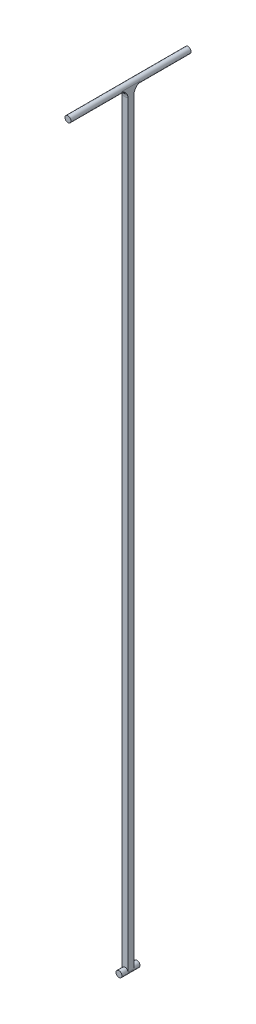
ISO-10303-21;
HEADER;
FILE_DESCRIPTION(('STEP AP214'),'2;1');
FILE_NAME('part.step','',(''),(''),'','','');
FILE_SCHEMA(('AUTOMOTIVE_DESIGN { 1 0 10303 214 1 1 1 1 }'));
ENDSEC;
DATA;
#1=APPLICATION_CONTEXT('core data for automotive mechanical design processes');
#2=APPLICATION_PROTOCOL_DEFINITION('international standard','automotive_design',2000,#1);
#3=PRODUCT_CONTEXT('',#1,'mechanical');
#4=PRODUCT('Part','Part','',(#3));
#5=PRODUCT_RELATED_PRODUCT_CATEGORY('part','',(#4));
#6=PRODUCT_DEFINITION_FORMATION('','',#4);
#7=PRODUCT_DEFINITION_CONTEXT('part definition',#1,'design');
#8=PRODUCT_DEFINITION('design','',#6,#7);
#9=PRODUCT_DEFINITION_SHAPE('','',#8);
#10=(LENGTH_UNIT() NAMED_UNIT(*) SI_UNIT(.MILLI.,.METRE.));
#11=(NAMED_UNIT(*) PLANE_ANGLE_UNIT() SI_UNIT($,.RADIAN.));
#12=(NAMED_UNIT(*) SI_UNIT($,.STERADIAN.) SOLID_ANGLE_UNIT());
#13=UNCERTAINTY_MEASURE_WITH_UNIT(LENGTH_MEASURE(1.E-05),#10,'distance_accuracy_value','');
#14=(GEOMETRIC_REPRESENTATION_CONTEXT(3) GLOBAL_UNCERTAINTY_ASSIGNED_CONTEXT((#13)) GLOBAL_UNIT_ASSIGNED_CONTEXT((#10,
#11,#12)) REPRESENTATION_CONTEXT('',''));
#15=CARTESIAN_POINT('',(0.,0.,0.));
#16=DIRECTION('',(0.,0.,1.));
#17=DIRECTION('',(1.,0.,0.));
#18=AXIS2_PLACEMENT_3D('',#15,#16,#17);
#19=CARTESIAN_POINT('',(2.54,647.7,50.8));
#20=DIRECTION('',(0.,0.,-1.));
#21=DIRECTION('',(-1.,0.,0.));
#22=AXIS2_PLACEMENT_3D('',#19,#20,#21);
#23=CYLINDRICAL_SURFACE('',#22,2.53999999999996);
#24=DIRECTION('',(0.,0.,-1.));
#25=VECTOR('',#24,1.);
#26=CARTESIAN_POINT('',(5.08,647.7,2.54));
#27=LINE('',#26,#25);
#28=CARTESIAN_POINT('',(5.07999999999996,647.7,7.62));
#29=VERTEX_POINT('',#28);
#30=CARTESIAN_POINT('',(5.07999999999996,647.7,-7.62));
#31=VERTEX_POINT('',#30);
#32=EDGE_CURVE('E57',#29,#31,#27,.T.);
#33=ORIENTED_EDGE('',*,*,#32,.T.);
#34=CARTESIAN_POINT('',(2.54,647.7,-7.62));
#35=DIRECTION('',(0.,0.,1.));
#36=DIRECTION('',(1.,0.,0.));
#37=AXIS2_PLACEMENT_3D('',#34,#35,#36);
#38=CIRCLE('',#37,2.53999999999996);
#39=CARTESIAN_POINT('',(0.,647.7,-7.62));
#40=VERTEX_POINT('',#39);
#41=EDGE_CURVE('E168',#31,#40,#38,.F.);
#42=ORIENTED_EDGE('',*,*,#41,.T.);
#43=DIRECTION('',(0.,0.,-1.));
#44=VECTOR('',#43,1.);
#45=CARTESIAN_POINT('',(0.,647.7,2.54));
#46=LINE('',#45,#44);
#47=CARTESIAN_POINT('',(0.,647.7,7.62));
#48=VERTEX_POINT('',#47);
#49=EDGE_CURVE('E64',#48,#40,#46,.T.);
#50=ORIENTED_EDGE('',*,*,#49,.F.);
#51=CARTESIAN_POINT('',(2.54,647.7,7.62));
#52=DIRECTION('',(0.,0.,1.));
#53=DIRECTION('',(1.,0.,0.));
#54=AXIS2_PLACEMENT_3D('',#51,#52,#53);
#55=CIRCLE('',#54,2.53999999999996);
#56=EDGE_CURVE('E135',#48,#29,#55,.T.);
#57=ORIENTED_EDGE('',*,*,#56,.T.);
#58=EDGE_LOOP('',(#33,#42,#50,#57));
#59=FACE_BOUND('',#58,.T.);
#60=CARTESIAN_POINT('',(2.54,647.7,50.8));
#61=DIRECTION('',(0.,0.,1.));
#62=DIRECTION('',(1.,0.,0.));
#63=AXIS2_PLACEMENT_3D('',#60,#61,#62);
#64=CIRCLE('',#63,2.53999999999996);
#65=CARTESIAN_POINT('',(5.07999999999996,647.7,50.8));
#66=VERTEX_POINT('',#65);
#67=EDGE_CURVE('E132',#66,#66,#64,.T.);
#68=ORIENTED_EDGE('',*,*,#67,.F.);
#69=EDGE_LOOP('',(#68));
#70=FACE_BOUND('',#69,.T.);
#71=CARTESIAN_POINT('',(2.54,647.7,-50.8));
#72=DIRECTION('',(0.,0.,1.));
#73=DIRECTION('',(1.,0.,0.));
#74=AXIS2_PLACEMENT_3D('',#71,#72,#73);
#75=CIRCLE('',#74,2.53999999999996);
#76=CARTESIAN_POINT('',(5.07999999999996,647.7,-50.8));
#77=VERTEX_POINT('',#76);
#78=EDGE_CURVE('E131',#77,#77,#75,.T.);
#79=ORIENTED_EDGE('',*,*,#78,.T.);
#80=EDGE_LOOP('',(#79));
#81=FACE_BOUND('',#80,.T.);
#82=ADVANCED_FACE('F37',(#59,#70,#81),#23,.T.);
#83=CARTESIAN_POINT('',(0.,0.,50.8));
#84=DIRECTION('',(0.,0.,1.));
#85=DIRECTION('',(1.,0.,0.));
#86=AXIS2_PLACEMENT_3D('',#83,#84,#85);
#87=PLANE('',#86);
#88=ORIENTED_EDGE('',*,*,#67,.T.);
#89=EDGE_LOOP('',(#88));
#90=FACE_BOUND('',#89,.T.);
#91=ADVANCED_FACE('F199',(#90),#87,.T.);
#92=CARTESIAN_POINT('',(0.,0.,-50.8));
#93=DIRECTION('',(0.,0.,1.));
#94=DIRECTION('',(1.,0.,0.));
#95=AXIS2_PLACEMENT_3D('',#92,#93,#94);
#96=PLANE('',#95);
#97=ORIENTED_EDGE('',*,*,#78,.F.);
#98=EDGE_LOOP('',(#97));
#99=FACE_BOUND('',#98,.T.);
#100=ADVANCED_FACE('F203',(#99),#96,.F.);
#101=CARTESIAN_POINT('',(0.,0.,2.54));
#102=DIRECTION('',(-1.,0.,0.));
#103=DIRECTION('',(0.,0.,1.));
#104=AXIS2_PLACEMENT_3D('',#101,#102,#103);
#105=PLANE('',#104);
#106=DIRECTION('',(0.,1.,0.));
#107=VECTOR('',#106,1.);
#108=CARTESIAN_POINT('',(0.,0.,-2.54));
#109=LINE('',#108,#107);
#110=CARTESIAN_POINT('',(0.,0.,-2.54));
#111=VERTEX_POINT('',#110);
#112=CARTESIAN_POINT('',(0.,640.515795103145,-2.54));
#113=VERTEX_POINT('',#112);
#114=EDGE_CURVE('E114',#111,#113,#109,.T.);
#115=ORIENTED_EDGE('',*,*,#114,.F.);
#116=DIRECTION('',(0.,0.,-1.));
#117=VECTOR('',#116,1.);
#118=CARTESIAN_POINT('',(0.,0.,2.54));
#119=LINE('',#118,#117);
#120=CARTESIAN_POINT('',(0.,0.,2.54));
#121=VERTEX_POINT('',#120);
#122=EDGE_CURVE('E97',#121,#111,#119,.T.);
#123=ORIENTED_EDGE('',*,*,#122,.F.);
#124=DIRECTION('',(0.,1.,0.));
#125=VECTOR('',#124,1.);
#126=CARTESIAN_POINT('',(0.,0.,2.54));
#127=LINE('',#126,#125);
#128=CARTESIAN_POINT('',(0.,640.515795103145,2.54));
#129=VERTEX_POINT('',#128);
#130=EDGE_CURVE('E111',#121,#129,#127,.T.);
#131=ORIENTED_EDGE('',*,*,#130,.T.);
#132=CARTESIAN_POINT('',(0.,640.515795103145,2.54));
#133=CARTESIAN_POINT('',(0.,640.677913402386,2.53997782210612));
#134=CARTESIAN_POINT('',(0.,640.839997087751,2.54689636916217));
#135=CARTESIAN_POINT('',(0.,641.16293905413,2.57413085099029));
#136=CARTESIAN_POINT('',(0.,641.323798032665,2.59443847574302));
#137=CARTESIAN_POINT('',(0.,641.642506162993,2.64782884435624));
#138=CARTESIAN_POINT('',(0.,641.800366625536,2.68084451828428));
#139=CARTESIAN_POINT('',(0.,642.113055814435,2.75905466480061));
#140=CARTESIAN_POINT('',(0.,642.267884058385,2.80425105864665));
#141=CARTESIAN_POINT('',(0.,642.58070383563,2.90846484135424));
#142=CARTESIAN_POINT('',(0.,642.738515879739,2.96802006900518));
#143=CARTESIAN_POINT('',(0.,643.049260725011,3.09883873769944));
#144=CARTESIAN_POINT('',(0.,643.202191672727,3.1701065645357));
#145=CARTESIAN_POINT('',(0.,643.502659133408,3.32344529845667));
#146=CARTESIAN_POINT('',(0.,643.650191808305,3.40552370801576));
#147=CARTESIAN_POINT('',(0.,643.939390760913,3.57946083076629));
#148=CARTESIAN_POINT('',(0.,644.081055581168,3.67132195379304));
#149=CARTESIAN_POINT('',(0.,644.447537866731,3.92578667631235));
#150=CARTESIAN_POINT('',(0.,644.667192036797,4.09586942697861));
#151=CARTESIAN_POINT('',(0.,645.090172695402,4.45525787478396));
#152=CARTESIAN_POINT('',(0.,645.293488871277,4.64457554508643));
#153=CARTESIAN_POINT('',(0.,645.685414197702,5.03837337326046));
#154=CARTESIAN_POINT('',(0.,645.873997891857,5.2428786346769));
#155=CARTESIAN_POINT('',(0.,646.238583028158,5.66281129752192));
#156=CARTESIAN_POINT('',(0.,646.41458026407,5.87824230946691));
#157=CARTESIAN_POINT('',(0.,646.682088329059,6.22022690890976));
#158=CARTESIAN_POINT('',(0.,646.776796427662,6.34431697695068));
#159=CARTESIAN_POINT('',(0.,646.963848556343,6.59403050275234));
#160=CARTESIAN_POINT('',(0.,647.056195326432,6.71965190782634));
#161=CARTESIAN_POINT('',(-1.57461347612243E-13,647.331178473491,7.09851652832316));
#162=CARTESIAN_POINT('',(-8.59491968866862E-13,647.511502858147,7.35342641884824));
#163=CARTESIAN_POINT('',(0.,647.694513318302,7.61224065871788));
#164=CARTESIAN_POINT('',(0.,647.697256660457,7.61612033036977));
#165=CARTESIAN_POINT('',(0.,647.7,7.62));
#166=B_SPLINE_CURVE_WITH_KNOTS('',3,(#132,#133,#134,#135,#136,#137,#138,#139,#140,#141,#142,
#143,#144,#145,#146,#147,#148,#149,#150,#151,#152,#153,#154,#155,#156,#157,#158,#159,#160,#161,
#162,#163,#164,#165),.UNSPECIFIED.,.F.,.F.,(4,2,2,2,2,2,2,2,2,2,2,2,2,2,2,2,4),(0.,
0.486156207553584,0.972010962739089,1.45533589878787,1.93873711405417,2.4442602810462,
2.94997317473188,3.45603889756689,3.96222957227925,4.79420354342264,5.62669860381471,
6.46060170736098,7.2947822007556,7.76306860814067,8.23078440609117,9.16747521363274,
9.18173003737773),.UNSPECIFIED.);
#167=EDGE_CURVE('E146',#129,#48,#166,.T.);
#168=ORIENTED_EDGE('',*,*,#167,.T.);
#169=ORIENTED_EDGE('',*,*,#49,.T.);
#170=CARTESIAN_POINT('',(0.,640.515795103145,-2.54));
#171=CARTESIAN_POINT('',(0.,640.677913402386,-2.53997782210612));
#172=CARTESIAN_POINT('',(0.,640.839997087751,-2.54689636916217));
#173=CARTESIAN_POINT('',(0.,641.16293905413,-2.57413085099029));
#174=CARTESIAN_POINT('',(0.,641.323798032665,-2.59443847574302));
#175=CARTESIAN_POINT('',(0.,641.642506162993,-2.64782884435624));
#176=CARTESIAN_POINT('',(0.,641.800366625536,-2.68084451828428));
#177=CARTESIAN_POINT('',(0.,642.113055814435,-2.75905466480061));
#178=CARTESIAN_POINT('',(0.,642.267884058385,-2.80425105864665));
#179=CARTESIAN_POINT('',(0.,642.58070383563,-2.90846484135424));
#180=CARTESIAN_POINT('',(0.,642.738515879739,-2.96802006900518));
#181=CARTESIAN_POINT('',(0.,643.049260725011,-3.09883873769944));
#182=CARTESIAN_POINT('',(0.,643.202191672727,-3.1701065645357));
#183=CARTESIAN_POINT('',(0.,643.502659133408,-3.32344529845667));
#184=CARTESIAN_POINT('',(0.,643.650191808305,-3.40552370801576));
#185=CARTESIAN_POINT('',(0.,643.939390760913,-3.57946083076629));
#186=CARTESIAN_POINT('',(0.,644.081055581168,-3.67132195379304));
#187=CARTESIAN_POINT('',(0.,644.447537866731,-3.92578667631235));
#188=CARTESIAN_POINT('',(0.,644.667192036797,-4.09586942697861));
#189=CARTESIAN_POINT('',(0.,645.090172695402,-4.45525787478396));
#190=CARTESIAN_POINT('',(0.,645.293488871277,-4.64457554508643));
#191=CARTESIAN_POINT('',(0.,645.685414197702,-5.03837337326046));
#192=CARTESIAN_POINT('',(0.,645.873997891857,-5.2428786346769));
#193=CARTESIAN_POINT('',(0.,646.238583028158,-5.66281129752192));
#194=CARTESIAN_POINT('',(0.,646.41458026407,-5.87824230946691));
#195=CARTESIAN_POINT('',(0.,646.682088329059,-6.22022690890976));
#196=CARTESIAN_POINT('',(0.,646.776796427662,-6.34431697695068));
#197=CARTESIAN_POINT('',(0.,646.963848556343,-6.59403050275234));
#198=CARTESIAN_POINT('',(0.,647.056195326432,-6.71965190782634));
#199=CARTESIAN_POINT('',(-1.57461347612243E-13,647.331178473491,-7.09851652832316));
#200=CARTESIAN_POINT('',(-8.59491968866862E-13,647.511502858147,-7.35342641884824));
#201=CARTESIAN_POINT('',(0.,647.694513318302,-7.61224065871788));
#202=CARTESIAN_POINT('',(0.,647.697256660457,-7.61612033036977));
#203=CARTESIAN_POINT('',(0.,647.7,-7.62));
#204=B_SPLINE_CURVE_WITH_KNOTS('',3,(#170,#171,#172,#173,#174,#175,#176,#177,#178,#179,#180,
#181,#182,#183,#184,#185,#186,#187,#188,#189,#190,#191,#192,#193,#194,#195,#196,#197,#198,#199,
#200,#201,#202,#203),.UNSPECIFIED.,.F.,.F.,(4,2,2,2,2,2,2,2,2,2,2,2,2,2,2,2,4),(0.,
0.486156207553584,0.972010962739089,1.45533589878787,1.93873711405417,2.4442602810462,
2.94997317473188,3.45603889756689,3.96222957227925,4.79420354342264,5.62669860381471,
6.46060170736098,7.2947822007556,7.76306860814067,8.23078440609117,9.16747521363274,
9.18173003737773),.UNSPECIFIED.);
#205=EDGE_CURVE('E11',#40,#113,#204,.F.);
#206=ORIENTED_EDGE('',*,*,#205,.T.);
#207=EDGE_LOOP('',(#115,#123,#131,#168,#169,#206));
#208=FACE_BOUND('',#207,.T.);
#209=ADVANCED_FACE('F110',(#208),#105,.T.);
#210=CARTESIAN_POINT('',(5.08,0.,2.54));
#211=DIRECTION('',(-1.,0.,0.));
#212=DIRECTION('',(0.,0.,1.));
#213=AXIS2_PLACEMENT_3D('',#210,#211,#212);
#214=PLANE('',#213);
#215=DIRECTION('',(0.,1.,0.));
#216=VECTOR('',#215,1.);
#217=CARTESIAN_POINT('',(5.08,0.,-2.54));
#218=LINE('',#217,#216);
#219=CARTESIAN_POINT('',(5.08,0.,-2.54));
#220=VERTEX_POINT('',#219);
#221=CARTESIAN_POINT('',(5.08,640.515795103145,-2.54));
#222=VERTEX_POINT('',#221);
#223=EDGE_CURVE('E120',#220,#222,#218,.T.);
#224=ORIENTED_EDGE('',*,*,#223,.T.);
#225=CARTESIAN_POINT('',(5.08000000000002,640.515795103145,-2.54));
#226=CARTESIAN_POINT('',(5.08000000000001,640.677913402386,-2.53997782210612));
#227=CARTESIAN_POINT('',(5.08,640.839997087751,-2.54689636916217));
#228=CARTESIAN_POINT('',(5.08,641.162939054129,-2.57413085099025));
#229=CARTESIAN_POINT('',(5.08,641.323798032664,-2.59443847574296));
#230=CARTESIAN_POINT('',(5.08,641.642506162992,-2.64782884435615));
#231=CARTESIAN_POINT('',(5.08,641.800366625535,-2.6808445182842));
#232=CARTESIAN_POINT('',(5.08,642.113055814435,-2.75905466480057));
#233=CARTESIAN_POINT('',(5.08,642.267884058385,-2.80425105864662));
#234=CARTESIAN_POINT('',(5.08,642.58070383563,-2.90846484135427));
#235=CARTESIAN_POINT('',(5.08,642.738515879739,-2.96802006900523));
#236=CARTESIAN_POINT('',(5.08,643.049260725011,-3.09883873769955));
#237=CARTESIAN_POINT('',(5.08,643.202191672727,-3.17010656453584));
#238=CARTESIAN_POINT('',(5.08,643.502659133408,-3.32344529845682));
#239=CARTESIAN_POINT('',(5.08,643.650191808305,-3.40552370801588));
#240=CARTESIAN_POINT('',(5.08,643.939390760914,-3.57946083076635));
#241=CARTESIAN_POINT('',(5.08,644.081055581168,-3.67132195379306));
#242=CARTESIAN_POINT('',(5.08,644.447537866731,-3.92578667631223));
#243=CARTESIAN_POINT('',(5.08,644.667192036797,-4.09586942697837));
#244=CARTESIAN_POINT('',(5.08,645.090172695402,-4.45525787478343));
#245=CARTESIAN_POINT('',(5.08,645.293488871276,-4.64457554508572));
#246=CARTESIAN_POINT('',(5.08,645.685414197701,-5.03837337325971));
#247=CARTESIAN_POINT('',(5.08,645.873997891857,-5.24287863467633));
#248=CARTESIAN_POINT('',(5.08,646.238583028157,-5.66281129752146));
#249=CARTESIAN_POINT('',(5.07999999999999,646.41458026407,-5.8782423094664));
#250=CARTESIAN_POINT('',(5.08000000000001,646.682088329058,-6.22022690890989));
#251=CARTESIAN_POINT('',(5.08000000000002,646.776796427662,-6.34431697695116));
#252=CARTESIAN_POINT('',(5.07999999999998,646.963848556344,-6.59403050275183));
#253=CARTESIAN_POINT('',(5.07999999999993,647.056195326435,-6.71965190782449));
#254=CARTESIAN_POINT('',(5.08000000000014,647.331178473485,-7.09851652832672));
#255=CARTESIAN_POINT('',(5.08000000000076,647.511502858119,-7.35342641886791));
#256=CARTESIAN_POINT('',(5.07999999999999,647.694513318301,-7.6122406587185));
#257=CARTESIAN_POINT('',(5.07999999999998,647.697256660457,-7.61612033037009));
#258=CARTESIAN_POINT('',(5.07999999999996,647.7,-7.62));
#259=B_SPLINE_CURVE_WITH_KNOTS('',3,(#225,#226,#227,#228,#229,#230,#231,#232,#233,#234,#235,
#236,#237,#238,#239,#240,#241,#242,#243,#244,#245,#246,#247,#248,#249,#250,#251,#252,#253,#254,
#255,#256,#257,#258),.UNSPECIFIED.,.F.,.F.,(4,2,2,2,2,2,2,2,2,2,2,2,2,2,2,2,4),(0.,
0.486156207553361,0.972010962738526,1.45533589878764,1.93873711405417,2.44426028104644,
2.94997317473226,3.45603889756702,3.96222957227925,4.79420354342195,5.62669860381347,
6.46060170736029,7.29478220075546,7.76306860814068,8.23078440609101,9.16747521363277,
9.18173003737772),.UNSPECIFIED.);
#260=EDGE_CURVE('E50',#222,#31,#259,.T.);
#261=ORIENTED_EDGE('',*,*,#260,.T.);
#262=ORIENTED_EDGE('',*,*,#32,.F.);
#263=CARTESIAN_POINT('',(5.08000000000002,640.515795103145,2.54));
#264=CARTESIAN_POINT('',(5.08000000000001,640.677913402386,2.53997782210612));
#265=CARTESIAN_POINT('',(5.08,640.839997087751,2.54689636916217));
#266=CARTESIAN_POINT('',(5.08,641.162939054129,2.57413085099025));
#267=CARTESIAN_POINT('',(5.08,641.323798032664,2.59443847574296));
#268=CARTESIAN_POINT('',(5.08,641.642506162992,2.64782884435615));
#269=CARTESIAN_POINT('',(5.08,641.800366625535,2.6808445182842));
#270=CARTESIAN_POINT('',(5.08,642.113055814435,2.75905466480057));
#271=CARTESIAN_POINT('',(5.08,642.267884058385,2.80425105864662));
#272=CARTESIAN_POINT('',(5.08,642.58070383563,2.90846484135427));
#273=CARTESIAN_POINT('',(5.08,642.738515879739,2.96802006900523));
#274=CARTESIAN_POINT('',(5.08,643.049260725011,3.09883873769955));
#275=CARTESIAN_POINT('',(5.08,643.202191672727,3.17010656453584));
#276=CARTESIAN_POINT('',(5.08,643.502659133408,3.32344529845682));
#277=CARTESIAN_POINT('',(5.08,643.650191808305,3.40552370801588));
#278=CARTESIAN_POINT('',(5.08,643.939390760914,3.57946083076635));
#279=CARTESIAN_POINT('',(5.08,644.081055581168,3.67132195379306));
#280=CARTESIAN_POINT('',(5.08,644.447537866731,3.92578667631223));
#281=CARTESIAN_POINT('',(5.08,644.667192036797,4.09586942697837));
#282=CARTESIAN_POINT('',(5.08,645.090172695402,4.45525787478343));
#283=CARTESIAN_POINT('',(5.08,645.293488871276,4.64457554508572));
#284=CARTESIAN_POINT('',(5.08,645.685414197701,5.03837337325971));
#285=CARTESIAN_POINT('',(5.08,645.873997891857,5.24287863467633));
#286=CARTESIAN_POINT('',(5.08,646.238583028157,5.66281129752146));
#287=CARTESIAN_POINT('',(5.07999999999999,646.41458026407,5.8782423094664));
#288=CARTESIAN_POINT('',(5.08000000000001,646.682088329058,6.22022690890989));
#289=CARTESIAN_POINT('',(5.08000000000002,646.776796427662,6.34431697695116));
#290=CARTESIAN_POINT('',(5.07999999999998,646.963848556344,6.59403050275183));
#291=CARTESIAN_POINT('',(5.07999999999993,647.056195326435,6.71965190782449));
#292=CARTESIAN_POINT('',(5.08000000000014,647.331178473485,7.09851652832672));
#293=CARTESIAN_POINT('',(5.08000000000076,647.511502858119,7.35342641886791));
#294=CARTESIAN_POINT('',(5.07999999999999,647.694513318301,7.6122406587185));
#295=CARTESIAN_POINT('',(5.07999999999998,647.697256660457,7.61612033037009));
#296=CARTESIAN_POINT('',(5.07999999999996,647.7,7.62));
#297=B_SPLINE_CURVE_WITH_KNOTS('',3,(#263,#264,#265,#266,#267,#268,#269,#270,#271,#272,#273,
#274,#275,#276,#277,#278,#279,#280,#281,#282,#283,#284,#285,#286,#287,#288,#289,#290,#291,#292,
#293,#294,#295,#296),.UNSPECIFIED.,.F.,.F.,(4,2,2,2,2,2,2,2,2,2,2,2,2,2,2,2,4),(0.,
0.486156207553361,0.972010962738526,1.45533589878764,1.93873711405417,2.44426028104644,
2.94997317473226,3.45603889756702,3.96222957227925,4.79420354342195,5.62669860381347,
6.46060170736029,7.29478220075546,7.76306860814068,8.23078440609101,9.16747521363277,
9.18173003737772),.UNSPECIFIED.);
#298=CARTESIAN_POINT('',(5.08,640.515795103145,2.54));
#299=VERTEX_POINT('',#298);
#300=EDGE_CURVE('E140',#29,#299,#297,.F.);
#301=ORIENTED_EDGE('',*,*,#300,.T.);
#302=DIRECTION('',(0.,1.,0.));
#303=VECTOR('',#302,1.);
#304=CARTESIAN_POINT('',(5.08,0.,2.54));
#305=LINE('',#304,#303);
#306=CARTESIAN_POINT('',(5.08,0.,2.54));
#307=VERTEX_POINT('',#306);
#308=EDGE_CURVE('E119',#307,#299,#305,.T.);
#309=ORIENTED_EDGE('',*,*,#308,.F.);
#310=DIRECTION('',(0.,0.,-1.));
#311=VECTOR('',#310,1.);
#312=CARTESIAN_POINT('',(5.08,0.,2.54));
#313=LINE('',#312,#311);
#314=EDGE_CURVE('E100',#307,#220,#313,.T.);
#315=ORIENTED_EDGE('',*,*,#314,.T.);
#316=EDGE_LOOP('',(#224,#261,#262,#301,#309,#315));
#317=FACE_BOUND('',#316,.T.);
#318=ADVANCED_FACE('F154',(#317),#214,.F.);
#319=CARTESIAN_POINT('',(0.,0.,2.54));
#320=DIRECTION('',(0.,0.,1.));
#321=DIRECTION('',(1.,0.,0.));
#322=AXIS2_PLACEMENT_3D('',#319,#320,#321);
#323=PLANE('',#322);
#324=ORIENTED_EDGE('',*,*,#308,.T.);
#325=CARTESIAN_POINT('',(2.54,647.7,2.54));
#326=DIRECTION('',(0.,0.,1.));
#327=DIRECTION('',(1.,0.,0.));
#328=AXIS2_PLACEMENT_3D('',#325,#326,#327);
#329=CIRCLE('',#328,7.61999999999996);
#330=EDGE_CURVE('E118',#299,#129,#329,.F.);
#331=ORIENTED_EDGE('',*,*,#330,.T.);
#332=ORIENTED_EDGE('',*,*,#130,.F.);
#333=CARTESIAN_POINT('',(2.54,0.,2.54));
#334=DIRECTION('',(0.,0.,1.));
#335=DIRECTION('',(1.,0.,0.));
#336=AXIS2_PLACEMENT_3D('',#333,#334,#335);
#337=CIRCLE('',#336,2.54);
#338=EDGE_CURVE('E93',#307,#121,#337,.T.);
#339=ORIENTED_EDGE('',*,*,#338,.F.);
#340=EDGE_LOOP('',(#324,#331,#332,#339));
#341=FACE_BOUND('',#340,.T.);
#342=ADVANCED_FACE('F116',(#341),#323,.T.);
#343=CARTESIAN_POINT('',(0.,0.,-2.54));
#344=DIRECTION('',(0.,0.,1.));
#345=DIRECTION('',(1.,0.,0.));
#346=AXIS2_PLACEMENT_3D('',#343,#344,#345);
#347=PLANE('',#346);
#348=ORIENTED_EDGE('',*,*,#114,.T.);
#349=CARTESIAN_POINT('',(2.54,647.7,-2.54));
#350=DIRECTION('',(0.,0.,1.));
#351=DIRECTION('',(1.,0.,0.));
#352=AXIS2_PLACEMENT_3D('',#349,#350,#351);
#353=CIRCLE('',#352,7.61999999999996);
#354=EDGE_CURVE('E169',#113,#222,#353,.T.);
#355=ORIENTED_EDGE('',*,*,#354,.T.);
#356=ORIENTED_EDGE('',*,*,#223,.F.);
#357=CARTESIAN_POINT('',(2.54,0.,-2.54));
#358=DIRECTION('',(0.,0.,1.));
#359=DIRECTION('',(1.,0.,0.));
#360=AXIS2_PLACEMENT_3D('',#357,#358,#359);
#361=CIRCLE('',#360,2.54);
#362=EDGE_CURVE('E106',#220,#111,#361,.T.);
#363=ORIENTED_EDGE('',*,*,#362,.T.);
#364=EDGE_LOOP('',(#348,#355,#356,#363));
#365=FACE_BOUND('',#364,.T.);
#366=ADVANCED_FACE('F159',(#365),#347,.F.);
#367=CARTESIAN_POINT('',(2.54,0.,7.62));
#368=DIRECTION('',(0.,0.,-1.));
#369=DIRECTION('',(-1.,0.,0.));
#370=AXIS2_PLACEMENT_3D('',#367,#368,#369);
#371=CYLINDRICAL_SURFACE('',#370,2.54);
#372=CARTESIAN_POINT('',(2.54,0.,7.62));
#373=DIRECTION('',(0.,0.,1.));
#374=DIRECTION('',(1.,0.,0.));
#375=AXIS2_PLACEMENT_3D('',#372,#373,#374);
#376=CIRCLE('',#375,2.54);
#377=CARTESIAN_POINT('',(5.08,0.,7.62));
#378=VERTEX_POINT('',#377);
#379=EDGE_CURVE('E105',#378,#378,#376,.T.);
#380=ORIENTED_EDGE('',*,*,#379,.F.);
#381=EDGE_LOOP('',(#380));
#382=FACE_BOUND('',#381,.T.);
#383=ORIENTED_EDGE('',*,*,#338,.T.);
#384=ORIENTED_EDGE('',*,*,#122,.T.);
#385=ORIENTED_EDGE('',*,*,#362,.F.);
#386=ORIENTED_EDGE('',*,*,#314,.F.);
#387=EDGE_LOOP('',(#383,#384,#385,#386));
#388=FACE_BOUND('',#387,.T.);
#389=CARTESIAN_POINT('',(2.54,0.,-7.62));
#390=DIRECTION('',(0.,0.,1.));
#391=DIRECTION('',(1.,0.,0.));
#392=AXIS2_PLACEMENT_3D('',#389,#390,#391);
#393=CIRCLE('',#392,2.54);
#394=CARTESIAN_POINT('',(5.08,0.,-7.62));
#395=VERTEX_POINT('',#394);
#396=EDGE_CURVE('E181',#395,#395,#393,.T.);
#397=ORIENTED_EDGE('',*,*,#396,.T.);
#398=EDGE_LOOP('',(#397));
#399=FACE_BOUND('',#398,.T.);
#400=ADVANCED_FACE('F95',(#382,#388,#399),#371,.T.);
#401=CARTESIAN_POINT('',(2.54,0.,7.62));
#402=DIRECTION('',(0.,0.,1.));
#403=DIRECTION('',(1.,0.,0.));
#404=AXIS2_PLACEMENT_3D('',#401,#402,#403);
#405=PLANE('',#404);
#406=ORIENTED_EDGE('',*,*,#379,.T.);
#407=EDGE_LOOP('',(#406));
#408=FACE_BOUND('',#407,.T.);
#409=ADVANCED_FACE('F188',(#408),#405,.T.);
#410=CARTESIAN_POINT('',(2.54,0.,-7.62));
#411=DIRECTION('',(0.,0.,1.));
#412=DIRECTION('',(1.,0.,0.));
#413=AXIS2_PLACEMENT_3D('',#410,#411,#412);
#414=PLANE('',#413);
#415=ORIENTED_EDGE('',*,*,#396,.F.);
#416=EDGE_LOOP('',(#415));
#417=FACE_BOUND('',#416,.T.);
#418=ADVANCED_FACE('F196',(#417),#414,.F.);
#419=CARTESIAN_POINT('',(2.54,647.7,7.62));
#420=DIRECTION('',(0.,0.,1.));
#421=DIRECTION('',(1.,0.,0.));
#422=AXIS2_PLACEMENT_3D('',#419,#420,#421);
#423=TOROIDAL_SURFACE('',#422,7.61999999999996,5.08);
#424=ORIENTED_EDGE('',*,*,#167,.F.);
#425=ORIENTED_EDGE('',*,*,#330,.F.);
#426=ORIENTED_EDGE('',*,*,#300,.F.);
#427=ORIENTED_EDGE('',*,*,#56,.F.);
#428=EDGE_LOOP('',(#424,#425,#426,#427));
#429=FACE_BOUND('',#428,.T.);
#430=ADVANCED_FACE('F151',(#429),#423,.F.);
#431=CARTESIAN_POINT('',(2.54,647.7,-7.62));
#432=DIRECTION('',(0.,0.,1.));
#433=DIRECTION('',(1.,0.,0.));
#434=AXIS2_PLACEMENT_3D('',#431,#432,#433);
#435=TOROIDAL_SURFACE('',#434,7.61999999999996,5.08);
#436=ORIENTED_EDGE('',*,*,#205,.F.);
#437=ORIENTED_EDGE('',*,*,#41,.F.);
#438=ORIENTED_EDGE('',*,*,#260,.F.);
#439=ORIENTED_EDGE('',*,*,#354,.F.);
#440=EDGE_LOOP('',(#436,#437,#438,#439));
#441=FACE_BOUND('',#440,.T.);
#442=ADVANCED_FACE('F39',(#441),#435,.F.);
#443=CLOSED_SHELL('',(#82,#91,#100,#209,#318,#342,#366,#400,#409,#418,#430,#442));
#444=MANIFOLD_SOLID_BREP('B2',#443);
#445=ADVANCED_BREP_SHAPE_REPRESENTATION('',(#18,#444),#14);
#446=SHAPE_DEFINITION_REPRESENTATION(#9,#445);
ENDSEC;
END-ISO-10303-21;
